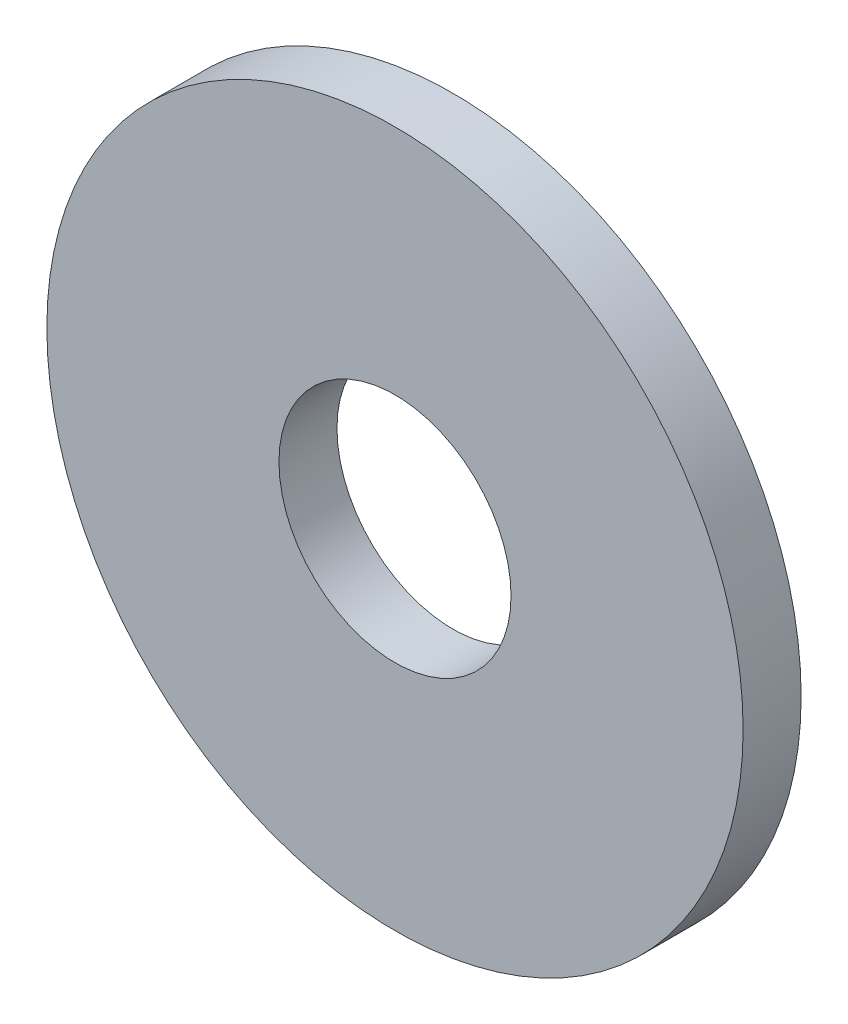
ISO-10303-21;
HEADER;
FILE_DESCRIPTION(('STEP AP214'),'2;1');
FILE_NAME('part.step','',(''),(''),'','','');
FILE_SCHEMA(('AUTOMOTIVE_DESIGN { 1 0 10303 214 1 1 1 1 }'));
ENDSEC;
DATA;
#1=APPLICATION_CONTEXT('core data for automotive mechanical design processes');
#2=APPLICATION_PROTOCOL_DEFINITION('international standard','automotive_design',2000,#1);
#3=PRODUCT_CONTEXT('',#1,'mechanical');
#4=PRODUCT('Part','Part','',(#3));
#5=PRODUCT_RELATED_PRODUCT_CATEGORY('part','',(#4));
#6=PRODUCT_DEFINITION_FORMATION('','',#4);
#7=PRODUCT_DEFINITION_CONTEXT('part definition',#1,'design');
#8=PRODUCT_DEFINITION('design','',#6,#7);
#9=PRODUCT_DEFINITION_SHAPE('','',#8);
#10=(LENGTH_UNIT() NAMED_UNIT(*) SI_UNIT(.MILLI.,.METRE.));
#11=(NAMED_UNIT(*) PLANE_ANGLE_UNIT() SI_UNIT($,.RADIAN.));
#12=(NAMED_UNIT(*) SI_UNIT($,.STERADIAN.) SOLID_ANGLE_UNIT());
#13=UNCERTAINTY_MEASURE_WITH_UNIT(LENGTH_MEASURE(1.E-05),#10,'distance_accuracy_value','');
#14=(GEOMETRIC_REPRESENTATION_CONTEXT(3) GLOBAL_UNCERTAINTY_ASSIGNED_CONTEXT((#13)) GLOBAL_UNIT_ASSIGNED_CONTEXT((#10,
#11,#12)) REPRESENTATION_CONTEXT('',''));
#15=CARTESIAN_POINT('',(0.,0.,0.));
#16=DIRECTION('',(0.,0.,1.));
#17=DIRECTION('',(1.,0.,0.));
#18=AXIS2_PLACEMENT_3D('',#15,#16,#17);
#19=CARTESIAN_POINT('',(0.,0.,1.));
#20=DIRECTION('',(0.,0.,-1.));
#21=DIRECTION('',(-1.,0.,0.));
#22=AXIS2_PLACEMENT_3D('',#19,#20,#21);
#23=CYLINDRICAL_SURFACE('',#22,6.);
#24=CARTESIAN_POINT('',(0.,0.,1.));
#25=DIRECTION('',(0.,0.,1.));
#26=DIRECTION('',(1.,0.,0.));
#27=AXIS2_PLACEMENT_3D('',#24,#25,#26);
#28=CIRCLE('',#27,6.);
#29=CARTESIAN_POINT('',(6.,0.,1.));
#30=VERTEX_POINT('',#29);
#31=EDGE_CURVE('E10',#30,#30,#28,.T.);
#32=ORIENTED_EDGE('',*,*,#31,.F.);
#33=EDGE_LOOP('',(#32));
#34=FACE_BOUND('',#33,.T.);
#35=CARTESIAN_POINT('',(0.,0.,0.));
#36=DIRECTION('',(0.,0.,1.));
#37=DIRECTION('',(1.,0.,0.));
#38=AXIS2_PLACEMENT_3D('',#35,#36,#37);
#39=CIRCLE('',#38,6.);
#40=CARTESIAN_POINT('',(6.,0.,0.));
#41=VERTEX_POINT('',#40);
#42=EDGE_CURVE('E44',#41,#41,#39,.T.);
#43=ORIENTED_EDGE('',*,*,#42,.T.);
#44=EDGE_LOOP('',(#43));
#45=FACE_BOUND('',#44,.T.);
#46=ADVANCED_FACE('F41',(#34,#45),#23,.T.);
#47=CARTESIAN_POINT('',(0.,0.,1.));
#48=DIRECTION('',(0.,0.,1.));
#49=DIRECTION('',(1.,0.,0.));
#50=AXIS2_PLACEMENT_3D('',#47,#48,#49);
#51=PLANE('',#50);
#52=CARTESIAN_POINT('',(0.,0.,1.));
#53=DIRECTION('',(0.,0.,1.));
#54=DIRECTION('',(1.,0.,0.));
#55=AXIS2_PLACEMENT_3D('',#52,#53,#54);
#56=CIRCLE('',#55,2.);
#57=CARTESIAN_POINT('',(2.,0.,1.));
#58=VERTEX_POINT('',#57);
#59=EDGE_CURVE('E55',#58,#58,#56,.T.);
#60=ORIENTED_EDGE('',*,*,#59,.F.);
#61=EDGE_LOOP('',(#60));
#62=FACE_BOUND('',#61,.T.);
#63=ORIENTED_EDGE('',*,*,#31,.T.);
#64=EDGE_LOOP('',(#63));
#65=FACE_BOUND('',#64,.T.);
#66=ADVANCED_FACE('F72',(#62,#65),#51,.T.);
#67=CARTESIAN_POINT('',(0.,0.,0.));
#68=DIRECTION('',(0.,0.,1.));
#69=DIRECTION('',(1.,0.,0.));
#70=AXIS2_PLACEMENT_3D('',#67,#68,#69);
#71=PLANE('',#70);
#72=CARTESIAN_POINT('',(0.,0.,0.));
#73=DIRECTION('',(0.,0.,1.));
#74=DIRECTION('',(1.,0.,0.));
#75=AXIS2_PLACEMENT_3D('',#72,#73,#74);
#76=CIRCLE('',#75,2.);
#77=CARTESIAN_POINT('',(2.,0.,0.));
#78=VERTEX_POINT('',#77);
#79=EDGE_CURVE('E53',#78,#78,#76,.T.);
#80=ORIENTED_EDGE('',*,*,#79,.T.);
#81=EDGE_LOOP('',(#80));
#82=FACE_BOUND('',#81,.T.);
#83=ORIENTED_EDGE('',*,*,#42,.F.);
#84=EDGE_LOOP('',(#83));
#85=FACE_BOUND('',#84,.T.);
#86=ADVANCED_FACE('F63',(#82,#85),#71,.F.);
#87=CARTESIAN_POINT('',(0.,0.,0.));
#88=DIRECTION('',(0.,0.,1.));
#89=DIRECTION('',(1.,0.,0.));
#90=AXIS2_PLACEMENT_3D('',#87,#88,#89);
#91=CYLINDRICAL_SURFACE('',#90,2.);
#92=ORIENTED_EDGE('',*,*,#79,.F.);
#93=EDGE_LOOP('',(#92));
#94=FACE_BOUND('',#93,.T.);
#95=ORIENTED_EDGE('',*,*,#59,.T.);
#96=EDGE_LOOP('',(#95));
#97=FACE_BOUND('',#96,.T.);
#98=ADVANCED_FACE('F66',(#94,#97),#91,.F.);
#99=CLOSED_SHELL('',(#46,#66,#86,#98));
#100=MANIFOLD_SOLID_BREP('B2',#99);
#101=ADVANCED_BREP_SHAPE_REPRESENTATION('',(#18,#100),#14);
#102=SHAPE_DEFINITION_REPRESENTATION(#9,#101);
ENDSEC;
END-ISO-10303-21;
